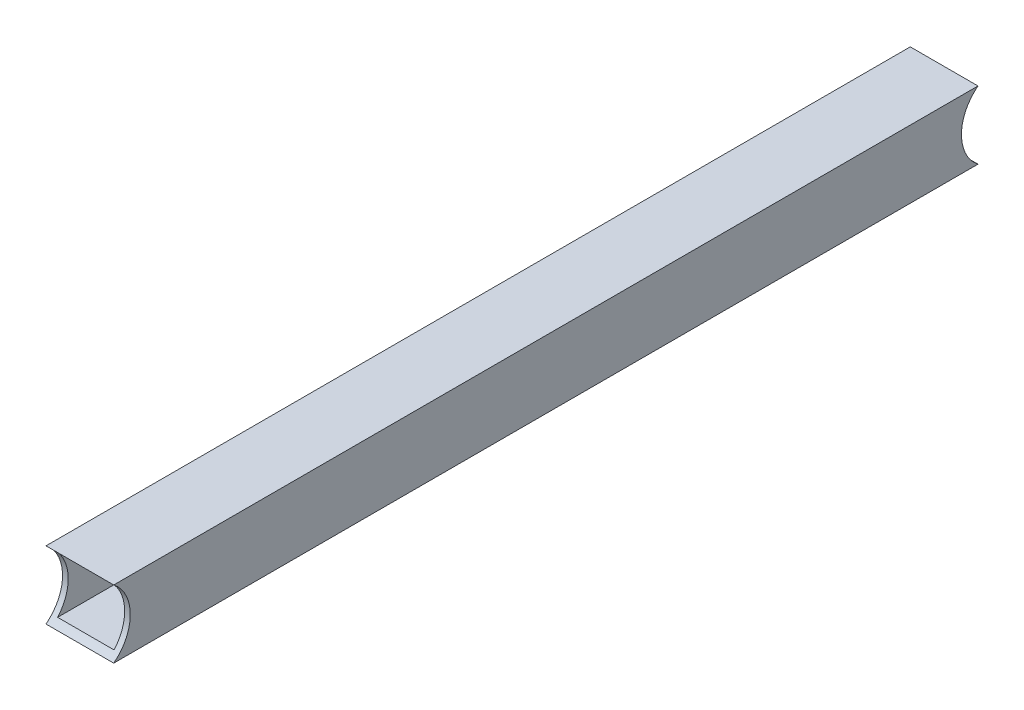
ISO-10303-21;
HEADER;
FILE_DESCRIPTION(('STEP AP214'),'2;1');
FILE_NAME('part.step','',(''),(''),'','','');
FILE_SCHEMA(('AUTOMOTIVE_DESIGN { 1 0 10303 214 1 1 1 1 }'));
ENDSEC;
DATA;
#1=APPLICATION_CONTEXT('core data for automotive mechanical design processes');
#2=APPLICATION_PROTOCOL_DEFINITION('international standard','automotive_design',2000,#1);
#3=PRODUCT_CONTEXT('',#1,'mechanical');
#4=PRODUCT('Part','Part','',(#3));
#5=PRODUCT_RELATED_PRODUCT_CATEGORY('part','',(#4));
#6=PRODUCT_DEFINITION_FORMATION('','',#4);
#7=PRODUCT_DEFINITION_CONTEXT('part definition',#1,'design');
#8=PRODUCT_DEFINITION('design','',#6,#7);
#9=PRODUCT_DEFINITION_SHAPE('','',#8);
#10=(LENGTH_UNIT() NAMED_UNIT(*) SI_UNIT(.MILLI.,.METRE.));
#11=(NAMED_UNIT(*) PLANE_ANGLE_UNIT() SI_UNIT($,.RADIAN.));
#12=(NAMED_UNIT(*) SI_UNIT($,.STERADIAN.) SOLID_ANGLE_UNIT());
#13=UNCERTAINTY_MEASURE_WITH_UNIT(LENGTH_MEASURE(1.E-05),#10,'distance_accuracy_value','');
#14=(GEOMETRIC_REPRESENTATION_CONTEXT(3) GLOBAL_UNCERTAINTY_ASSIGNED_CONTEXT((#13)) GLOBAL_UNIT_ASSIGNED_CONTEXT((#10,
#11,#12)) REPRESENTATION_CONTEXT('',''));
#15=CARTESIAN_POINT('',(0.,0.,0.));
#16=DIRECTION('',(0.,0.,1.));
#17=DIRECTION('',(1.,0.,0.));
#18=AXIS2_PLACEMENT_3D('',#15,#16,#17);
#19=CARTESIAN_POINT('',(38.1,19.05,-515.75716));
#20=DIRECTION('',(-1.,0.,0.));
#21=DIRECTION('',(0.,0.,1.));
#22=AXIS2_PLACEMENT_3D('',#19,#20,#21);
#23=CYLINDRICAL_SURFACE('',#22,24.1299999999999);
#24=DIRECTION('',(-1.,0.,0.));
#25=VECTOR('',#24,1.);
#26=CARTESIAN_POINT('',(38.1,34.925,-497.584618213007));
#27=LINE('',#26,#25);
#28=CARTESIAN_POINT('',(3.175,34.925,-497.584618213007));
#29=VERTEX_POINT('',#28);
#30=CARTESIAN_POINT('',(34.925,34.925,-497.584618213007));
#31=VERTEX_POINT('',#30);
#32=EDGE_CURVE('E105',#29,#31,#27,.F.);
#33=ORIENTED_EDGE('',*,*,#32,.F.);
#34=CARTESIAN_POINT('',(3.175,19.05,-515.75716));
#35=DIRECTION('',(-1.,0.,0.));
#36=DIRECTION('',(0.,0.,1.));
#37=AXIS2_PLACEMENT_3D('',#34,#35,#36);
#38=CIRCLE('',#37,24.1299999999999);
#39=CARTESIAN_POINT('',(3.175,3.175,-497.584618213007));
#40=VERTEX_POINT('',#39);
#41=EDGE_CURVE('E94',#40,#29,#38,.T.);
#42=ORIENTED_EDGE('',*,*,#41,.F.);
#43=DIRECTION('',(-1.,0.,0.));
#44=VECTOR('',#43,1.);
#45=CARTESIAN_POINT('',(38.1,3.175,-497.584618213007));
#46=LINE('',#45,#44);
#47=CARTESIAN_POINT('',(34.925,3.175,-497.584618213007));
#48=VERTEX_POINT('',#47);
#49=EDGE_CURVE('E99',#48,#40,#46,.T.);
#50=ORIENTED_EDGE('',*,*,#49,.F.);
#51=CARTESIAN_POINT('',(34.925,19.05,-515.75716));
#52=DIRECTION('',(1.,0.,0.));
#53=DIRECTION('',(0.,0.,-1.));
#54=AXIS2_PLACEMENT_3D('',#51,#52,#53);
#55=CIRCLE('',#54,24.1299999999999);
#56=EDGE_CURVE('E112',#31,#48,#55,.T.);
#57=ORIENTED_EDGE('',*,*,#56,.F.);
#58=EDGE_LOOP('',(#33,#42,#50,#57));
#59=FACE_BOUND('',#58,.T.);
#60=CARTESIAN_POINT('',(0.,19.05,-515.75716));
#61=DIRECTION('',(1.,0.,0.));
#62=DIRECTION('',(0.,0.,-1.));
#63=AXIS2_PLACEMENT_3D('',#60,#61,#62);
#64=CIRCLE('',#63,24.1299999999999);
#65=CARTESIAN_POINT('',(0.,38.1,-500.946542187093));
#66=VERTEX_POINT('',#65);
#67=CARTESIAN_POINT('',(0.,0.,-500.946542187093));
#68=VERTEX_POINT('',#67);
#69=EDGE_CURVE('E113',#66,#68,#64,.T.);
#70=ORIENTED_EDGE('',*,*,#69,.F.);
#71=DIRECTION('',(-1.,0.,0.));
#72=VECTOR('',#71,1.);
#73=CARTESIAN_POINT('',(38.1,38.1,-500.946542187093));
#74=LINE('',#73,#72);
#75=CARTESIAN_POINT('',(38.1,38.1,-500.946542187093));
#76=VERTEX_POINT('',#75);
#77=EDGE_CURVE('E146',#76,#66,#74,.T.);
#78=ORIENTED_EDGE('',*,*,#77,.F.);
#79=CARTESIAN_POINT('',(38.1,19.05,-515.75716));
#80=DIRECTION('',(1.,0.,0.));
#81=DIRECTION('',(0.,0.,-1.));
#82=AXIS2_PLACEMENT_3D('',#79,#80,#81);
#83=CIRCLE('',#82,24.1299999999999);
#84=CARTESIAN_POINT('',(38.1,0.,-500.946542187093));
#85=VERTEX_POINT('',#84);
#86=EDGE_CURVE('E121',#76,#85,#83,.T.);
#87=ORIENTED_EDGE('',*,*,#86,.T.);
#88=DIRECTION('',(-1.,0.,0.));
#89=VECTOR('',#88,1.);
#90=CARTESIAN_POINT('',(38.1,0.,-500.946542187093));
#91=LINE('',#90,#89);
#92=EDGE_CURVE('E132',#85,#68,#91,.T.);
#93=ORIENTED_EDGE('',*,*,#92,.T.);
#94=EDGE_LOOP('',(#70,#78,#87,#93));
#95=FACE_BOUND('',#94,.T.);
#96=ADVANCED_FACE('F34',(#59,#95),#23,.F.);
#97=CARTESIAN_POINT('',(38.1,38.1,0.));
#98=DIRECTION('',(0.,1.,0.));
#99=DIRECTION('',(0.,0.,1.));
#100=AXIS2_PLACEMENT_3D('',#97,#98,#99);
#101=PLANE('',#100);
#102=DIRECTION('',(0.,0.,-1.));
#103=VECTOR('',#102,1.);
#104=CARTESIAN_POINT('',(0.,38.1,0.));
#105=LINE('',#104,#103);
#106=CARTESIAN_POINT('',(0.,38.1,-14.8106178129071));
#107=VERTEX_POINT('',#106);
#108=EDGE_CURVE('E116',#107,#66,#105,.T.);
#109=ORIENTED_EDGE('',*,*,#108,.F.);
#110=DIRECTION('',(-1.,0.,0.));
#111=VECTOR('',#110,1.);
#112=CARTESIAN_POINT('',(38.1,38.1,-14.8106178129071));
#113=LINE('',#112,#111);
#114=CARTESIAN_POINT('',(38.1,38.1,-14.8106178129071));
#115=VERTEX_POINT('',#114);
#116=EDGE_CURVE('E144',#115,#107,#113,.T.);
#117=ORIENTED_EDGE('',*,*,#116,.F.);
#118=DIRECTION('',(0.,0.,-1.));
#119=VECTOR('',#118,1.);
#120=CARTESIAN_POINT('',(38.1,38.1,0.));
#121=LINE('',#120,#119);
#122=EDGE_CURVE('E124',#115,#76,#121,.T.);
#123=ORIENTED_EDGE('',*,*,#122,.T.);
#124=ORIENTED_EDGE('',*,*,#77,.T.);
#125=EDGE_LOOP('',(#109,#117,#123,#124));
#126=FACE_BOUND('',#125,.T.);
#127=ADVANCED_FACE('F175',(#126),#101,.T.);
#128=CARTESIAN_POINT('',(38.1,19.05,0.));
#129=DIRECTION('',(-1.,0.,0.));
#130=DIRECTION('',(0.,0.,1.));
#131=AXIS2_PLACEMENT_3D('',#128,#129,#130);
#132=CYLINDRICAL_SURFACE('',#131,24.13);
#133=DIRECTION('',(-1.,0.,0.));
#134=VECTOR('',#133,1.);
#135=CARTESIAN_POINT('',(38.1,34.925,-18.1725417869928));
#136=LINE('',#135,#134);
#137=CARTESIAN_POINT('',(34.925,34.925,-18.1725417869928));
#138=VERTEX_POINT('',#137);
#139=CARTESIAN_POINT('',(3.175,34.925,-18.1725417869928));
#140=VERTEX_POINT('',#139);
#141=EDGE_CURVE('E11',#138,#140,#136,.T.);
#142=ORIENTED_EDGE('',*,*,#141,.F.);
#143=CARTESIAN_POINT('',(34.925,19.05,0.));
#144=DIRECTION('',(1.,0.,0.));
#145=DIRECTION('',(0.,0.,-1.));
#146=AXIS2_PLACEMENT_3D('',#143,#144,#145);
#147=CIRCLE('',#146,24.13);
#148=CARTESIAN_POINT('',(34.925,3.175,-18.1725417869928));
#149=VERTEX_POINT('',#148);
#150=EDGE_CURVE('E41',#149,#138,#147,.T.);
#151=ORIENTED_EDGE('',*,*,#150,.F.);
#152=DIRECTION('',(-1.,0.,0.));
#153=VECTOR('',#152,1.);
#154=CARTESIAN_POINT('',(38.1,3.175,-18.1725417869928));
#155=LINE('',#154,#153);
#156=CARTESIAN_POINT('',(3.175,3.175,-18.1725417869928));
#157=VERTEX_POINT('',#156);
#158=EDGE_CURVE('E150',#157,#149,#155,.F.);
#159=ORIENTED_EDGE('',*,*,#158,.F.);
#160=CARTESIAN_POINT('',(3.175,19.05,0.));
#161=DIRECTION('',(-1.,0.,0.));
#162=DIRECTION('',(0.,0.,1.));
#163=AXIS2_PLACEMENT_3D('',#160,#161,#162);
#164=CIRCLE('',#163,24.13);
#165=EDGE_CURVE('E148',#140,#157,#164,.T.);
#166=ORIENTED_EDGE('',*,*,#165,.F.);
#167=EDGE_LOOP('',(#142,#151,#159,#166));
#168=FACE_BOUND('',#167,.T.);
#169=CARTESIAN_POINT('',(0.,19.05,0.));
#170=DIRECTION('',(1.,0.,0.));
#171=DIRECTION('',(0.,0.,-1.));
#172=AXIS2_PLACEMENT_3D('',#169,#170,#171);
#173=CIRCLE('',#172,24.13);
#174=CARTESIAN_POINT('',(0.,0.,-14.8106178129071));
#175=VERTEX_POINT('',#174);
#176=EDGE_CURVE('E136',#175,#107,#173,.T.);
#177=ORIENTED_EDGE('',*,*,#176,.F.);
#178=DIRECTION('',(-1.,0.,0.));
#179=VECTOR('',#178,1.);
#180=CARTESIAN_POINT('',(38.1,0.,-14.8106178129071));
#181=LINE('',#180,#179);
#182=CARTESIAN_POINT('',(38.1,0.,-14.8106178129071));
#183=VERTEX_POINT('',#182);
#184=EDGE_CURVE('E142',#183,#175,#181,.T.);
#185=ORIENTED_EDGE('',*,*,#184,.F.);
#186=CARTESIAN_POINT('',(38.1,19.05,0.));
#187=DIRECTION('',(1.,0.,0.));
#188=DIRECTION('',(0.,0.,-1.));
#189=AXIS2_PLACEMENT_3D('',#186,#187,#188);
#190=CIRCLE('',#189,24.13);
#191=EDGE_CURVE('E128',#183,#115,#190,.T.);
#192=ORIENTED_EDGE('',*,*,#191,.T.);
#193=ORIENTED_EDGE('',*,*,#116,.T.);
#194=EDGE_LOOP('',(#177,#185,#192,#193));
#195=FACE_BOUND('',#194,.T.);
#196=ADVANCED_FACE('F160',(#168,#195),#132,.F.);
#197=CARTESIAN_POINT('',(38.1,0.,0.));
#198=DIRECTION('',(0.,1.,0.));
#199=DIRECTION('',(0.,0.,1.));
#200=AXIS2_PLACEMENT_3D('',#197,#198,#199);
#201=PLANE('',#200);
#202=DIRECTION('',(0.,0.,-1.));
#203=VECTOR('',#202,1.);
#204=CARTESIAN_POINT('',(0.,0.,0.));
#205=LINE('',#204,#203);
#206=EDGE_CURVE('E125',#175,#68,#205,.T.);
#207=ORIENTED_EDGE('',*,*,#206,.T.);
#208=ORIENTED_EDGE('',*,*,#92,.F.);
#209=DIRECTION('',(0.,0.,-1.));
#210=VECTOR('',#209,1.);
#211=CARTESIAN_POINT('',(38.1,0.,0.));
#212=LINE('',#211,#210);
#213=EDGE_CURVE('E131',#183,#85,#212,.T.);
#214=ORIENTED_EDGE('',*,*,#213,.F.);
#215=ORIENTED_EDGE('',*,*,#184,.T.);
#216=EDGE_LOOP('',(#207,#208,#214,#215));
#217=FACE_BOUND('',#216,.T.);
#218=ADVANCED_FACE('F183',(#217),#201,.F.);
#219=CARTESIAN_POINT('',(38.1,0.,0.));
#220=DIRECTION('',(1.,0.,0.));
#221=DIRECTION('',(0.,0.,-1.));
#222=AXIS2_PLACEMENT_3D('',#219,#220,#221);
#223=PLANE('',#222);
#224=ORIENTED_EDGE('',*,*,#86,.F.);
#225=ORIENTED_EDGE('',*,*,#122,.F.);
#226=ORIENTED_EDGE('',*,*,#191,.F.);
#227=ORIENTED_EDGE('',*,*,#213,.T.);
#228=EDGE_LOOP('',(#224,#225,#226,#227));
#229=FACE_BOUND('',#228,.T.);
#230=ADVANCED_FACE('F189',(#229),#223,.T.);
#231=CARTESIAN_POINT('',(0.,0.,0.));
#232=DIRECTION('',(1.,0.,0.));
#233=DIRECTION('',(0.,0.,-1.));
#234=AXIS2_PLACEMENT_3D('',#231,#232,#233);
#235=PLANE('',#234);
#236=ORIENTED_EDGE('',*,*,#69,.T.);
#237=ORIENTED_EDGE('',*,*,#206,.F.);
#238=ORIENTED_EDGE('',*,*,#176,.T.);
#239=ORIENTED_EDGE('',*,*,#108,.T.);
#240=EDGE_LOOP('',(#236,#237,#238,#239));
#241=FACE_BOUND('',#240,.T.);
#242=ADVANCED_FACE('F191',(#241),#235,.F.);
#243=CARTESIAN_POINT('',(34.925,34.925,-500.946542187093));
#244=DIRECTION('',(0.,1.,0.));
#245=DIRECTION('',(0.,0.,1.));
#246=AXIS2_PLACEMENT_3D('',#243,#244,#245);
#247=PLANE('',#246);
#248=ORIENTED_EDGE('',*,*,#32,.T.);
#249=DIRECTION('',(0.,0.,1.));
#250=VECTOR('',#249,1.);
#251=CARTESIAN_POINT('',(34.925,34.925,-500.946542187093));
#252=LINE('',#251,#250);
#253=EDGE_CURVE('E100',#31,#138,#252,.T.);
#254=ORIENTED_EDGE('',*,*,#253,.T.);
#255=ORIENTED_EDGE('',*,*,#141,.T.);
#256=DIRECTION('',(0.,0.,1.));
#257=VECTOR('',#256,1.);
#258=CARTESIAN_POINT('',(3.175,34.925,-500.946542187093));
#259=LINE('',#258,#257);
#260=EDGE_CURVE('E53',#29,#140,#259,.T.);
#261=ORIENTED_EDGE('',*,*,#260,.F.);
#262=EDGE_LOOP('',(#248,#254,#255,#261));
#263=FACE_BOUND('',#262,.T.);
#264=ADVANCED_FACE('F103',(#263),#247,.F.);
#265=CARTESIAN_POINT('',(34.925,3.175,-500.946542187093));
#266=DIRECTION('',(1.,0.,0.));
#267=DIRECTION('',(0.,0.,-1.));
#268=AXIS2_PLACEMENT_3D('',#265,#266,#267);
#269=PLANE('',#268);
#270=ORIENTED_EDGE('',*,*,#56,.T.);
#271=DIRECTION('',(0.,0.,1.));
#272=VECTOR('',#271,1.);
#273=CARTESIAN_POINT('',(34.925,3.175,-500.946542187093));
#274=LINE('',#273,#272);
#275=EDGE_CURVE('E156',#48,#149,#274,.T.);
#276=ORIENTED_EDGE('',*,*,#275,.T.);
#277=ORIENTED_EDGE('',*,*,#150,.T.);
#278=ORIENTED_EDGE('',*,*,#253,.F.);
#279=EDGE_LOOP('',(#270,#276,#277,#278));
#280=FACE_BOUND('',#279,.T.);
#281=ADVANCED_FACE('F154',(#280),#269,.F.);
#282=CARTESIAN_POINT('',(3.175,3.175,-500.946542187093));
#283=DIRECTION('',(0.,-1.,0.));
#284=DIRECTION('',(0.,0.,-1.));
#285=AXIS2_PLACEMENT_3D('',#282,#283,#284);
#286=PLANE('',#285);
#287=ORIENTED_EDGE('',*,*,#49,.T.);
#288=DIRECTION('',(0.,0.,1.));
#289=VECTOR('',#288,1.);
#290=CARTESIAN_POINT('',(3.175,3.175,-500.946542187093));
#291=LINE('',#290,#289);
#292=EDGE_CURVE('E48',#40,#157,#291,.T.);
#293=ORIENTED_EDGE('',*,*,#292,.T.);
#294=ORIENTED_EDGE('',*,*,#158,.T.);
#295=ORIENTED_EDGE('',*,*,#275,.F.);
#296=EDGE_LOOP('',(#287,#293,#294,#295));
#297=FACE_BOUND('',#296,.T.);
#298=ADVANCED_FACE('F163',(#297),#286,.F.);
#299=CARTESIAN_POINT('',(3.175,34.925,-500.946542187093));
#300=DIRECTION('',(-1.,0.,0.));
#301=DIRECTION('',(0.,0.,1.));
#302=AXIS2_PLACEMENT_3D('',#299,#300,#301);
#303=PLANE('',#302);
#304=ORIENTED_EDGE('',*,*,#41,.T.);
#305=ORIENTED_EDGE('',*,*,#260,.T.);
#306=ORIENTED_EDGE('',*,*,#165,.T.);
#307=ORIENTED_EDGE('',*,*,#292,.F.);
#308=EDGE_LOOP('',(#304,#305,#306,#307));
#309=FACE_BOUND('',#308,.T.);
#310=ADVANCED_FACE('F95',(#309),#303,.F.);
#311=CLOSED_SHELL('',(#96,#127,#196,#218,#230,#242,#264,#281,#298,#310));
#312=MANIFOLD_SOLID_BREP('B2',#311);
#313=ADVANCED_BREP_SHAPE_REPRESENTATION('',(#18,#312),#14);
#314=SHAPE_DEFINITION_REPRESENTATION(#9,#313);
ENDSEC;
END-ISO-10303-21;
